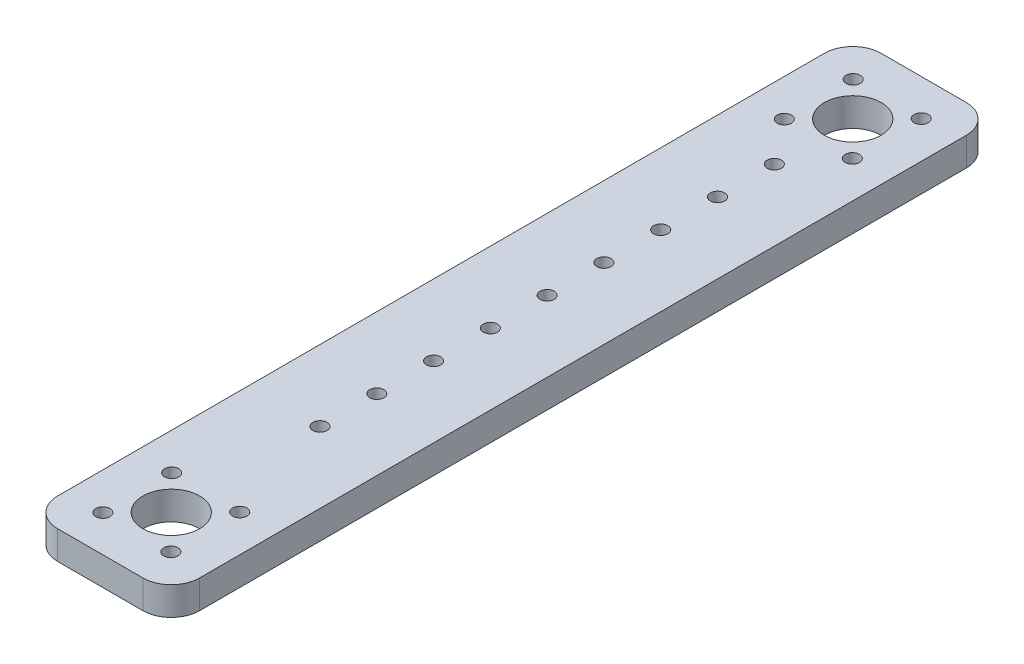
ISO-10303-21;
HEADER;
FILE_DESCRIPTION(('STEP AP214'),'2;1');
FILE_NAME('part.step','',(''),(''),'','','');
FILE_SCHEMA(('AUTOMOTIVE_DESIGN { 1 0 10303 214 1 1 1 1 }'));
ENDSEC;
DATA;
#1=APPLICATION_CONTEXT('core data for automotive mechanical design processes');
#2=APPLICATION_PROTOCOL_DEFINITION('international standard','automotive_design',2000,#1);
#3=PRODUCT_CONTEXT('',#1,'mechanical');
#4=PRODUCT('Part','Part','',(#3));
#5=PRODUCT_RELATED_PRODUCT_CATEGORY('part','',(#4));
#6=PRODUCT_DEFINITION_FORMATION('','',#4);
#7=PRODUCT_DEFINITION_CONTEXT('part definition',#1,'design');
#8=PRODUCT_DEFINITION('design','',#6,#7);
#9=PRODUCT_DEFINITION_SHAPE('','',#8);
#10=(LENGTH_UNIT() NAMED_UNIT(*) SI_UNIT(.MILLI.,.METRE.));
#11=(NAMED_UNIT(*) PLANE_ANGLE_UNIT() SI_UNIT($,.RADIAN.));
#12=(NAMED_UNIT(*) SI_UNIT($,.STERADIAN.) SOLID_ANGLE_UNIT());
#13=UNCERTAINTY_MEASURE_WITH_UNIT(LENGTH_MEASURE(1.E-05),#10,'distance_accuracy_value','');
#14=(GEOMETRIC_REPRESENTATION_CONTEXT(3) GLOBAL_UNCERTAINTY_ASSIGNED_CONTEXT((#13)) GLOBAL_UNIT_ASSIGNED_CONTEXT((#10,
#11,#12)) REPRESENTATION_CONTEXT('',''));
#15=CARTESIAN_POINT('',(0.,0.,0.));
#16=DIRECTION('',(0.,0.,1.));
#17=DIRECTION('',(1.,0.,0.));
#18=AXIS2_PLACEMENT_3D('',#15,#16,#17);
#19=CARTESIAN_POINT('',(0.,25.4,0.));
#20=DIRECTION('',(-1.,0.,0.));
#21=DIRECTION('',(0.,0.,1.));
#22=AXIS2_PLACEMENT_3D('',#19,#20,#21);
#23=PLANE('',#22);
#24=DIRECTION('',(0.,0.,-1.));
#25=VECTOR('',#24,1.);
#26=CARTESIAN_POINT('',(0.,25.4,0.));
#27=LINE('',#26,#25);
#28=CARTESIAN_POINT('',(0.,25.4,-25.4));
#29=VERTEX_POINT('',#28);
#30=CARTESIAN_POINT('',(0.,25.4,-711.2));
#31=VERTEX_POINT('',#30);
#32=EDGE_CURVE('E123',#29,#31,#27,.T.);
#33=ORIENTED_EDGE('',*,*,#32,.F.);
#34=DIRECTION('',(0.,-1.,0.));
#35=VECTOR('',#34,1.);
#36=CARTESIAN_POINT('',(0.,0.,-25.4));
#37=LINE('',#36,#35);
#38=CARTESIAN_POINT('',(0.,0.,-25.4));
#39=VERTEX_POINT('',#38);
#40=EDGE_CURVE('E153',#29,#39,#37,.T.);
#41=ORIENTED_EDGE('',*,*,#40,.T.);
#42=DIRECTION('',(0.,0.,-1.));
#43=VECTOR('',#42,1.);
#44=CARTESIAN_POINT('',(0.,0.,0.));
#45=LINE('',#44,#43);
#46=CARTESIAN_POINT('',(0.,0.,-711.2));
#47=VERTEX_POINT('',#46);
#48=EDGE_CURVE('E107',#39,#47,#45,.T.);
#49=ORIENTED_EDGE('',*,*,#48,.T.);
#50=DIRECTION('',(0.,-1.,0.));
#51=VECTOR('',#50,1.);
#52=CARTESIAN_POINT('',(0.,25.4,-711.2));
#53=LINE('',#52,#51);
#54=EDGE_CURVE('E151',#47,#31,#53,.F.);
#55=ORIENTED_EDGE('',*,*,#54,.T.);
#56=EDGE_LOOP('',(#33,#41,#49,#55));
#57=FACE_BOUND('',#56,.T.);
#58=ADVANCED_FACE('F37',(#57),#23,.F.);
#59=CARTESIAN_POINT('',(0.,25.4,-736.6));
#60=DIRECTION('',(0.,0.,1.));
#61=DIRECTION('',(1.,0.,0.));
#62=AXIS2_PLACEMENT_3D('',#59,#60,#61);
#63=PLANE('',#62);
#64=DIRECTION('',(-1.,0.,0.));
#65=VECTOR('',#64,1.);
#66=CARTESIAN_POINT('',(0.,0.,-736.6));
#67=LINE('',#66,#65);
#68=CARTESIAN_POINT('',(-25.4,0.,-736.6));
#69=VERTEX_POINT('',#68);
#70=CARTESIAN_POINT('',(-101.6,0.,-736.6));
#71=VERTEX_POINT('',#70);
#72=EDGE_CURVE('E158',#69,#71,#67,.T.);
#73=ORIENTED_EDGE('',*,*,#72,.T.);
#74=DIRECTION('',(0.,-1.,0.));
#75=VECTOR('',#74,1.);
#76=CARTESIAN_POINT('',(-101.6,25.4,-736.6));
#77=LINE('',#76,#75);
#78=CARTESIAN_POINT('',(-101.6,25.4,-736.6));
#79=VERTEX_POINT('',#78);
#80=EDGE_CURVE('E11',#71,#79,#77,.F.);
#81=ORIENTED_EDGE('',*,*,#80,.T.);
#82=DIRECTION('',(-1.,0.,0.));
#83=VECTOR('',#82,1.);
#84=CARTESIAN_POINT('',(0.,25.4,-736.6));
#85=LINE('',#84,#83);
#86=CARTESIAN_POINT('',(-25.4,25.4,-736.6));
#87=VERTEX_POINT('',#86);
#88=EDGE_CURVE('E159',#87,#79,#85,.T.);
#89=ORIENTED_EDGE('',*,*,#88,.F.);
#90=DIRECTION('',(0.,-1.,0.));
#91=VECTOR('',#90,1.);
#92=CARTESIAN_POINT('',(-25.4,25.4,-736.6));
#93=LINE('',#92,#91);
#94=EDGE_CURVE('E45',#87,#69,#93,.T.);
#95=ORIENTED_EDGE('',*,*,#94,.T.);
#96=EDGE_LOOP('',(#73,#81,#89,#95));
#97=FACE_BOUND('',#96,.T.);
#98=ADVANCED_FACE('F157',(#97),#63,.F.);
#99=CARTESIAN_POINT('',(-127.,25.4,0.));
#100=DIRECTION('',(-1.,0.,0.));
#101=DIRECTION('',(0.,0.,1.));
#102=AXIS2_PLACEMENT_3D('',#99,#100,#101);
#103=PLANE('',#102);
#104=DIRECTION('',(0.,0.,-1.));
#105=VECTOR('',#104,1.);
#106=CARTESIAN_POINT('',(-127.,0.,0.));
#107=LINE('',#106,#105);
#108=CARTESIAN_POINT('',(-127.,0.,-25.4));
#109=VERTEX_POINT('',#108);
#110=CARTESIAN_POINT('',(-127.,0.,-711.2));
#111=VERTEX_POINT('',#110);
#112=EDGE_CURVE('E124',#109,#111,#107,.T.);
#113=ORIENTED_EDGE('',*,*,#112,.F.);
#114=DIRECTION('',(0.,-1.,0.));
#115=VECTOR('',#114,1.);
#116=CARTESIAN_POINT('',(-127.,25.4,-25.4));
#117=LINE('',#116,#115);
#118=CARTESIAN_POINT('',(-127.,25.4,-25.4));
#119=VERTEX_POINT('',#118);
#120=EDGE_CURVE('E143',#109,#119,#117,.F.);
#121=ORIENTED_EDGE('',*,*,#120,.T.);
#122=DIRECTION('',(0.,0.,-1.));
#123=VECTOR('',#122,1.);
#124=CARTESIAN_POINT('',(-127.,25.4,0.));
#125=LINE('',#124,#123);
#126=CARTESIAN_POINT('',(-127.,25.4,-711.2));
#127=VERTEX_POINT('',#126);
#128=EDGE_CURVE('E133',#119,#127,#125,.T.);
#129=ORIENTED_EDGE('',*,*,#128,.T.);
#130=DIRECTION('',(0.,-1.,0.));
#131=VECTOR('',#130,1.);
#132=CARTESIAN_POINT('',(-127.,0.,-711.2));
#133=LINE('',#132,#131);
#134=EDGE_CURVE('E140',#127,#111,#133,.T.);
#135=ORIENTED_EDGE('',*,*,#134,.T.);
#136=EDGE_LOOP('',(#113,#121,#129,#135));
#137=FACE_BOUND('',#136,.T.);
#138=ADVANCED_FACE('F334',(#137),#103,.T.);
#139=CARTESIAN_POINT('',(0.,25.4,0.));
#140=DIRECTION('',(0.,0.,1.));
#141=DIRECTION('',(1.,0.,0.));
#142=AXIS2_PLACEMENT_3D('',#139,#140,#141);
#143=PLANE('',#142);
#144=DIRECTION('',(-1.,0.,0.));
#145=VECTOR('',#144,1.);
#146=CARTESIAN_POINT('',(0.,25.4,0.));
#147=LINE('',#146,#145);
#148=CARTESIAN_POINT('',(-25.4,25.4,0.));
#149=VERTEX_POINT('',#148);
#150=CARTESIAN_POINT('',(-101.6,25.4,0.));
#151=VERTEX_POINT('',#150);
#152=EDGE_CURVE('E129',#149,#151,#147,.T.);
#153=ORIENTED_EDGE('',*,*,#152,.T.);
#154=DIRECTION('',(0.,-1.,0.));
#155=VECTOR('',#154,1.);
#156=CARTESIAN_POINT('',(-101.6,25.4,0.));
#157=LINE('',#156,#155);
#158=CARTESIAN_POINT('',(-101.6,0.,0.));
#159=VERTEX_POINT('',#158);
#160=EDGE_CURVE('E122',#151,#159,#157,.T.);
#161=ORIENTED_EDGE('',*,*,#160,.T.);
#162=DIRECTION('',(-1.,0.,0.));
#163=VECTOR('',#162,1.);
#164=CARTESIAN_POINT('',(0.,0.,0.));
#165=LINE('',#164,#163);
#166=CARTESIAN_POINT('',(-25.4,0.,0.));
#167=VERTEX_POINT('',#166);
#168=EDGE_CURVE('E105',#167,#159,#165,.T.);
#169=ORIENTED_EDGE('',*,*,#168,.F.);
#170=DIRECTION('',(0.,-1.,0.));
#171=VECTOR('',#170,1.);
#172=CARTESIAN_POINT('',(-25.4,25.4,0.));
#173=LINE('',#172,#171);
#174=EDGE_CURVE('E119',#167,#149,#173,.F.);
#175=ORIENTED_EDGE('',*,*,#174,.T.);
#176=EDGE_LOOP('',(#153,#161,#169,#175));
#177=FACE_BOUND('',#176,.T.);
#178=ADVANCED_FACE('F118',(#177),#143,.T.);
#179=CARTESIAN_POINT('',(0.,25.4,0.));
#180=DIRECTION('',(0.,1.,0.));
#181=DIRECTION('',(0.,0.,1.));
#182=AXIS2_PLACEMENT_3D('',#179,#180,#181);
#183=PLANE('',#182);
#184=CARTESIAN_POINT('',(-93.9235081240994,25.4,-703.91598071188));
#185=DIRECTION('',(0.,1.,0.));
#186=DIRECTION('',(0.,0.,1.));
#187=AXIS2_PLACEMENT_3D('',#184,#185,#186);
#188=CIRCLE('',#187,6.34999999999999);
#189=CARTESIAN_POINT('',(-93.9235081240994,25.4,-697.56598071188));
#190=VERTEX_POINT('',#189);
#191=EDGE_CURVE('E280',#190,#190,#188,.T.);
#192=ORIENTED_EDGE('',*,*,#191,.F.);
#193=EDGE_LOOP('',(#192));
#194=FACE_BOUND('',#193,.T.);
#195=CARTESIAN_POINT('',(-33.0764918759006,25.4,-703.91598071188));
#196=DIRECTION('',(0.,1.,0.));
#197=DIRECTION('',(0.,0.,1.));
#198=AXIS2_PLACEMENT_3D('',#195,#196,#197);
#199=CIRCLE('',#198,6.35);
#200=CARTESIAN_POINT('',(-33.0764918759006,25.4,-697.56598071188));
#201=VERTEX_POINT('',#200);
#202=EDGE_CURVE('E274',#201,#201,#199,.T.);
#203=ORIENTED_EDGE('',*,*,#202,.F.);
#204=EDGE_LOOP('',(#203));
#205=FACE_BOUND('',#204,.T.);
#206=CARTESIAN_POINT('',(-33.0764918759006,25.4,-642.28401928812));
#207=DIRECTION('',(0.,1.,0.));
#208=DIRECTION('',(0.,0.,1.));
#209=AXIS2_PLACEMENT_3D('',#206,#207,#208);
#210=CIRCLE('',#209,6.35);
#211=CARTESIAN_POINT('',(-33.0764918759006,25.4,-635.93401928812));
#212=VERTEX_POINT('',#211);
#213=EDGE_CURVE('E268',#212,#212,#210,.T.);
#214=ORIENTED_EDGE('',*,*,#213,.F.);
#215=EDGE_LOOP('',(#214));
#216=FACE_BOUND('',#215,.T.);
#217=CARTESIAN_POINT('',(-93.9235081240994,25.4,-642.28401928812));
#218=DIRECTION('',(0.,1.,0.));
#219=DIRECTION('',(0.,0.,1.));
#220=AXIS2_PLACEMENT_3D('',#217,#218,#219);
#221=CIRCLE('',#220,6.34999999999999);
#222=CARTESIAN_POINT('',(-93.9235081240994,25.4,-635.93401928812));
#223=VERTEX_POINT('',#222);
#224=EDGE_CURVE('E262',#223,#223,#221,.T.);
#225=ORIENTED_EDGE('',*,*,#224,.F.);
#226=EDGE_LOOP('',(#225));
#227=FACE_BOUND('',#226,.T.);
#228=CARTESIAN_POINT('',(-63.5,25.4,-602.937236363598));
#229=DIRECTION('',(0.,1.,0.));
#230=DIRECTION('',(0.,0.,1.));
#231=AXIS2_PLACEMENT_3D('',#228,#229,#230);
#232=CIRCLE('',#231,6.34999999999999);
#233=CARTESIAN_POINT('',(-63.5,25.4,-596.587236363598));
#234=VERTEX_POINT('',#233);
#235=EDGE_CURVE('E256',#234,#234,#232,.T.);
#236=ORIENTED_EDGE('',*,*,#235,.F.);
#237=EDGE_LOOP('',(#236));
#238=FACE_BOUND('',#237,.T.);
#239=CARTESIAN_POINT('',(-63.4999999999995,25.4,-552.137236363598));
#240=DIRECTION('',(0.,1.,0.));
#241=DIRECTION('',(0.,0.,1.));
#242=AXIS2_PLACEMENT_3D('',#239,#240,#241);
#243=CIRCLE('',#242,6.34999999999999);
#244=CARTESIAN_POINT('',(-63.4999999999995,25.4,-545.787236363598));
#245=VERTEX_POINT('',#244);
#246=EDGE_CURVE('E250',#245,#245,#243,.T.);
#247=ORIENTED_EDGE('',*,*,#246,.F.);
#248=EDGE_LOOP('',(#247));
#249=FACE_BOUND('',#248,.T.);
#250=CARTESIAN_POINT('',(-63.4999999999989,25.4,-501.337236363598));
#251=DIRECTION('',(0.,1.,0.));
#252=DIRECTION('',(0.,0.,1.));
#253=AXIS2_PLACEMENT_3D('',#250,#251,#252);
#254=CIRCLE('',#253,6.34999999999999);
#255=CARTESIAN_POINT('',(-63.4999999999989,25.4,-494.987236363598));
#256=VERTEX_POINT('',#255);
#257=EDGE_CURVE('E244',#256,#256,#254,.T.);
#258=ORIENTED_EDGE('',*,*,#257,.F.);
#259=EDGE_LOOP('',(#258));
#260=FACE_BOUND('',#259,.T.);
#261=CARTESIAN_POINT('',(-63.4999999999984,25.4,-450.537236363598));
#262=DIRECTION('',(0.,1.,0.));
#263=DIRECTION('',(0.,0.,1.));
#264=AXIS2_PLACEMENT_3D('',#261,#262,#263);
#265=CIRCLE('',#264,6.34999999999999);
#266=CARTESIAN_POINT('',(-63.4999999999984,25.4,-444.187236363598));
#267=VERTEX_POINT('',#266);
#268=EDGE_CURVE('E238',#267,#267,#265,.T.);
#269=ORIENTED_EDGE('',*,*,#268,.F.);
#270=EDGE_LOOP('',(#269));
#271=FACE_BOUND('',#270,.T.);
#272=CARTESIAN_POINT('',(-63.4999999999979,25.4,-399.737236363598));
#273=DIRECTION('',(0.,1.,0.));
#274=DIRECTION('',(0.,0.,1.));
#275=AXIS2_PLACEMENT_3D('',#272,#273,#274);
#276=CIRCLE('',#275,6.34999999999999);
#277=CARTESIAN_POINT('',(-63.4999999999979,25.4,-393.387236363598));
#278=VERTEX_POINT('',#277);
#279=EDGE_CURVE('E232',#278,#278,#276,.T.);
#280=ORIENTED_EDGE('',*,*,#279,.F.);
#281=EDGE_LOOP('',(#280));
#282=FACE_BOUND('',#281,.T.);
#283=CARTESIAN_POINT('',(-63.4999999999973,25.4,-348.937236363598));
#284=DIRECTION('',(0.,1.,0.));
#285=DIRECTION('',(0.,0.,1.));
#286=AXIS2_PLACEMENT_3D('',#283,#284,#285);
#287=CIRCLE('',#286,6.34999999999999);
#288=CARTESIAN_POINT('',(-63.4999999999973,25.4,-342.587236363598));
#289=VERTEX_POINT('',#288);
#290=EDGE_CURVE('E226',#289,#289,#287,.T.);
#291=ORIENTED_EDGE('',*,*,#290,.F.);
#292=EDGE_LOOP('',(#291));
#293=FACE_BOUND('',#292,.T.);
#294=CARTESIAN_POINT('',(-63.4999999999968,25.4,-298.137236363598));
#295=DIRECTION('',(0.,1.,0.));
#296=DIRECTION('',(0.,0.,1.));
#297=AXIS2_PLACEMENT_3D('',#294,#295,#296);
#298=CIRCLE('',#297,6.34999999999999);
#299=CARTESIAN_POINT('',(-63.4999999999968,25.4,-291.787236363598));
#300=VERTEX_POINT('',#299);
#301=EDGE_CURVE('E220',#300,#300,#298,.T.);
#302=ORIENTED_EDGE('',*,*,#301,.F.);
#303=EDGE_LOOP('',(#302));
#304=FACE_BOUND('',#303,.T.);
#305=CARTESIAN_POINT('',(-63.4999999999963,25.4,-247.337236363598));
#306=DIRECTION('',(0.,1.,0.));
#307=DIRECTION('',(0.,0.,1.));
#308=AXIS2_PLACEMENT_3D('',#305,#306,#307);
#309=CIRCLE('',#308,6.34999999999999);
#310=CARTESIAN_POINT('',(-63.4999999999963,25.4,-240.987236363598));
#311=VERTEX_POINT('',#310);
#312=EDGE_CURVE('E214',#311,#311,#309,.T.);
#313=ORIENTED_EDGE('',*,*,#312,.F.);
#314=EDGE_LOOP('',(#313));
#315=FACE_BOUND('',#314,.T.);
#316=CARTESIAN_POINT('',(-63.4999999999957,25.4,-196.537236363598));
#317=DIRECTION('',(0.,1.,0.));
#318=DIRECTION('',(0.,0.,1.));
#319=AXIS2_PLACEMENT_3D('',#316,#317,#318);
#320=CIRCLE('',#319,6.34999999999999);
#321=CARTESIAN_POINT('',(-63.4999999999957,25.4,-190.187236363598));
#322=VERTEX_POINT('',#321);
#323=EDGE_CURVE('E208',#322,#322,#320,.T.);
#324=ORIENTED_EDGE('',*,*,#323,.F.);
#325=EDGE_LOOP('',(#324));
#326=FACE_BOUND('',#325,.T.);
#327=CARTESIAN_POINT('',(-93.9235081240994,25.4,-32.68401928812));
#328=DIRECTION('',(0.,1.,0.));
#329=DIRECTION('',(0.,0.,1.));
#330=AXIS2_PLACEMENT_3D('',#327,#328,#329);
#331=CIRCLE('',#330,6.34999999999999);
#332=CARTESIAN_POINT('',(-93.9235081240994,25.4,-26.33401928812));
#333=VERTEX_POINT('',#332);
#334=EDGE_CURVE('E202',#333,#333,#331,.T.);
#335=ORIENTED_EDGE('',*,*,#334,.F.);
#336=EDGE_LOOP('',(#335));
#337=FACE_BOUND('',#336,.T.);
#338=CARTESIAN_POINT('',(-93.9235081240994,25.4,-94.31598071188));
#339=DIRECTION('',(0.,1.,0.));
#340=DIRECTION('',(0.,0.,1.));
#341=AXIS2_PLACEMENT_3D('',#338,#339,#340);
#342=CIRCLE('',#341,6.34999999999999);
#343=CARTESIAN_POINT('',(-93.9235081240994,25.4,-87.96598071188));
#344=VERTEX_POINT('',#343);
#345=EDGE_CURVE('E196',#344,#344,#342,.T.);
#346=ORIENTED_EDGE('',*,*,#345,.F.);
#347=EDGE_LOOP('',(#346));
#348=FACE_BOUND('',#347,.T.);
#349=CARTESIAN_POINT('',(-33.0764918759006,25.4,-94.31598071188));
#350=DIRECTION('',(0.,1.,0.));
#351=DIRECTION('',(0.,0.,1.));
#352=AXIS2_PLACEMENT_3D('',#349,#350,#351);
#353=CIRCLE('',#352,6.35);
#354=CARTESIAN_POINT('',(-33.0764918759006,25.4,-87.96598071188));
#355=VERTEX_POINT('',#354);
#356=EDGE_CURVE('E190',#355,#355,#353,.T.);
#357=ORIENTED_EDGE('',*,*,#356,.F.);
#358=EDGE_LOOP('',(#357));
#359=FACE_BOUND('',#358,.T.);
#360=CARTESIAN_POINT('',(-33.0764918759006,25.4,-32.68401928812));
#361=DIRECTION('',(0.,1.,0.));
#362=DIRECTION('',(0.,0.,1.));
#363=AXIS2_PLACEMENT_3D('',#360,#361,#362);
#364=CIRCLE('',#363,6.35);
#365=CARTESIAN_POINT('',(-33.0764918759006,25.4,-26.33401928812));
#366=VERTEX_POINT('',#365);
#367=EDGE_CURVE('E184',#366,#366,#364,.T.);
#368=ORIENTED_EDGE('',*,*,#367,.F.);
#369=EDGE_LOOP('',(#368));
#370=FACE_BOUND('',#369,.T.);
#371=CARTESIAN_POINT('',(-63.5,25.4,-673.1));
#372=DIRECTION('',(0.,1.,0.));
#373=DIRECTION('',(0.,0.,1.));
#374=AXIS2_PLACEMENT_3D('',#371,#372,#373);
#375=CIRCLE('',#374,25.4);
#376=CARTESIAN_POINT('',(-63.5,25.4,-647.7));
#377=VERTEX_POINT('',#376);
#378=EDGE_CURVE('E178',#377,#377,#375,.T.);
#379=ORIENTED_EDGE('',*,*,#378,.F.);
#380=EDGE_LOOP('',(#379));
#381=FACE_BOUND('',#380,.T.);
#382=CARTESIAN_POINT('',(-63.5,25.4,-63.5));
#383=DIRECTION('',(0.,1.,0.));
#384=DIRECTION('',(0.,0.,1.));
#385=AXIS2_PLACEMENT_3D('',#382,#383,#384);
#386=CIRCLE('',#385,25.4);
#387=CARTESIAN_POINT('',(-63.5,25.4,-38.1));
#388=VERTEX_POINT('',#387);
#389=EDGE_CURVE('E172',#388,#388,#386,.T.);
#390=ORIENTED_EDGE('',*,*,#389,.F.);
#391=EDGE_LOOP('',(#390));
#392=FACE_BOUND('',#391,.T.);
#393=ORIENTED_EDGE('',*,*,#128,.F.);
#394=CARTESIAN_POINT('',(-101.6,25.4,-25.4));
#395=DIRECTION('',(0.,1.,0.));
#396=DIRECTION('',(0.,0.,1.));
#397=AXIS2_PLACEMENT_3D('',#394,#395,#396);
#398=CIRCLE('',#397,25.4);
#399=EDGE_CURVE('E149',#119,#151,#398,.T.);
#400=ORIENTED_EDGE('',*,*,#399,.T.);
#401=ORIENTED_EDGE('',*,*,#152,.F.);
#402=CARTESIAN_POINT('',(-25.4,25.4,-25.4));
#403=DIRECTION('',(0.,1.,0.));
#404=DIRECTION('',(0.,0.,1.));
#405=AXIS2_PLACEMENT_3D('',#402,#403,#404);
#406=CIRCLE('',#405,25.4);
#407=EDGE_CURVE('E128',#149,#29,#406,.T.);
#408=ORIENTED_EDGE('',*,*,#407,.T.);
#409=ORIENTED_EDGE('',*,*,#32,.T.);
#410=CARTESIAN_POINT('',(-25.4,25.4,-711.2));
#411=DIRECTION('',(0.,1.,0.));
#412=DIRECTION('',(0.,0.,1.));
#413=AXIS2_PLACEMENT_3D('',#410,#411,#412);
#414=CIRCLE('',#413,25.4);
#415=EDGE_CURVE('E57',#31,#87,#414,.T.);
#416=ORIENTED_EDGE('',*,*,#415,.T.);
#417=ORIENTED_EDGE('',*,*,#88,.T.);
#418=CARTESIAN_POINT('',(-101.6,25.4,-711.2));
#419=DIRECTION('',(0.,1.,0.));
#420=DIRECTION('',(0.,0.,1.));
#421=AXIS2_PLACEMENT_3D('',#418,#419,#420);
#422=CIRCLE('',#421,25.4);
#423=EDGE_CURVE('E146',#79,#127,#422,.T.);
#424=ORIENTED_EDGE('',*,*,#423,.T.);
#425=EDGE_LOOP('',(#393,#400,#401,#408,#409,#416,#417,#424));
#426=FACE_BOUND('',#425,.T.);
#427=ADVANCED_FACE('F286',(#194,#205,#216,#227,#238,#249,#260,#271,#282,#293,#304,#315,#326,
#337,#348,#359,#370,#381,#392,#426),#183,.T.);
#428=CARTESIAN_POINT('',(0.,0.,0.));
#429=DIRECTION('',(0.,1.,0.));
#430=DIRECTION('',(0.,0.,1.));
#431=AXIS2_PLACEMENT_3D('',#428,#429,#430);
#432=PLANE('',#431);
#433=CARTESIAN_POINT('',(-93.9235081240994,0.,-703.91598071188));
#434=DIRECTION('',(0.,1.,0.));
#435=DIRECTION('',(0.,0.,1.));
#436=AXIS2_PLACEMENT_3D('',#433,#434,#435);
#437=CIRCLE('',#436,6.34999999999999);
#438=CARTESIAN_POINT('',(-93.9235081240994,0.,-697.56598071188));
#439=VERTEX_POINT('',#438);
#440=EDGE_CURVE('E277',#439,#439,#437,.T.);
#441=ORIENTED_EDGE('',*,*,#440,.T.);
#442=EDGE_LOOP('',(#441));
#443=FACE_BOUND('',#442,.T.);
#444=CARTESIAN_POINT('',(-33.0764918759006,0.,-703.91598071188));
#445=DIRECTION('',(0.,1.,0.));
#446=DIRECTION('',(0.,0.,1.));
#447=AXIS2_PLACEMENT_3D('',#444,#445,#446);
#448=CIRCLE('',#447,6.34999999999999);
#449=CARTESIAN_POINT('',(-33.0764918759006,0.,-697.56598071188));
#450=VERTEX_POINT('',#449);
#451=EDGE_CURVE('E271',#450,#450,#448,.T.);
#452=ORIENTED_EDGE('',*,*,#451,.T.);
#453=EDGE_LOOP('',(#452));
#454=FACE_BOUND('',#453,.T.);
#455=CARTESIAN_POINT('',(-33.0764918759006,0.,-642.28401928812));
#456=DIRECTION('',(0.,1.,0.));
#457=DIRECTION('',(0.,0.,1.));
#458=AXIS2_PLACEMENT_3D('',#455,#456,#457);
#459=CIRCLE('',#458,6.34999999999999);
#460=CARTESIAN_POINT('',(-33.0764918759006,0.,-635.93401928812));
#461=VERTEX_POINT('',#460);
#462=EDGE_CURVE('E265',#461,#461,#459,.T.);
#463=ORIENTED_EDGE('',*,*,#462,.T.);
#464=EDGE_LOOP('',(#463));
#465=FACE_BOUND('',#464,.T.);
#466=CARTESIAN_POINT('',(-93.9235081240994,0.,-642.28401928812));
#467=DIRECTION('',(0.,1.,0.));
#468=DIRECTION('',(0.,0.,1.));
#469=AXIS2_PLACEMENT_3D('',#466,#467,#468);
#470=CIRCLE('',#469,6.34999999999999);
#471=CARTESIAN_POINT('',(-93.9235081240994,0.,-635.93401928812));
#472=VERTEX_POINT('',#471);
#473=EDGE_CURVE('E259',#472,#472,#470,.T.);
#474=ORIENTED_EDGE('',*,*,#473,.T.);
#475=EDGE_LOOP('',(#474));
#476=FACE_BOUND('',#475,.T.);
#477=CARTESIAN_POINT('',(-63.5,0.,-602.937236363598));
#478=DIRECTION('',(0.,1.,0.));
#479=DIRECTION('',(0.,0.,1.));
#480=AXIS2_PLACEMENT_3D('',#477,#478,#479);
#481=CIRCLE('',#480,6.34999999999999);
#482=CARTESIAN_POINT('',(-63.5,0.,-596.587236363598));
#483=VERTEX_POINT('',#482);
#484=EDGE_CURVE('E253',#483,#483,#481,.T.);
#485=ORIENTED_EDGE('',*,*,#484,.T.);
#486=EDGE_LOOP('',(#485));
#487=FACE_BOUND('',#486,.T.);
#488=CARTESIAN_POINT('',(-63.4999999999995,0.,-552.137236363598));
#489=DIRECTION('',(0.,1.,0.));
#490=DIRECTION('',(0.,0.,1.));
#491=AXIS2_PLACEMENT_3D('',#488,#489,#490);
#492=CIRCLE('',#491,6.34999999999999);
#493=CARTESIAN_POINT('',(-63.4999999999995,0.,-545.787236363598));
#494=VERTEX_POINT('',#493);
#495=EDGE_CURVE('E247',#494,#494,#492,.T.);
#496=ORIENTED_EDGE('',*,*,#495,.T.);
#497=EDGE_LOOP('',(#496));
#498=FACE_BOUND('',#497,.T.);
#499=CARTESIAN_POINT('',(-63.4999999999989,0.,-501.337236363598));
#500=DIRECTION('',(0.,1.,0.));
#501=DIRECTION('',(0.,0.,1.));
#502=AXIS2_PLACEMENT_3D('',#499,#500,#501);
#503=CIRCLE('',#502,6.34999999999999);
#504=CARTESIAN_POINT('',(-63.4999999999989,0.,-494.987236363598));
#505=VERTEX_POINT('',#504);
#506=EDGE_CURVE('E241',#505,#505,#503,.T.);
#507=ORIENTED_EDGE('',*,*,#506,.T.);
#508=EDGE_LOOP('',(#507));
#509=FACE_BOUND('',#508,.T.);
#510=CARTESIAN_POINT('',(-63.4999999999984,0.,-450.537236363598));
#511=DIRECTION('',(0.,1.,0.));
#512=DIRECTION('',(0.,0.,1.));
#513=AXIS2_PLACEMENT_3D('',#510,#511,#512);
#514=CIRCLE('',#513,6.34999999999999);
#515=CARTESIAN_POINT('',(-63.4999999999984,0.,-444.187236363598));
#516=VERTEX_POINT('',#515);
#517=EDGE_CURVE('E235',#516,#516,#514,.T.);
#518=ORIENTED_EDGE('',*,*,#517,.T.);
#519=EDGE_LOOP('',(#518));
#520=FACE_BOUND('',#519,.T.);
#521=CARTESIAN_POINT('',(-63.4999999999979,0.,-399.737236363598));
#522=DIRECTION('',(0.,1.,0.));
#523=DIRECTION('',(0.,0.,1.));
#524=AXIS2_PLACEMENT_3D('',#521,#522,#523);
#525=CIRCLE('',#524,6.34999999999999);
#526=CARTESIAN_POINT('',(-63.4999999999979,0.,-393.387236363598));
#527=VERTEX_POINT('',#526);
#528=EDGE_CURVE('E229',#527,#527,#525,.T.);
#529=ORIENTED_EDGE('',*,*,#528,.T.);
#530=EDGE_LOOP('',(#529));
#531=FACE_BOUND('',#530,.T.);
#532=CARTESIAN_POINT('',(-63.4999999999973,0.,-348.937236363598));
#533=DIRECTION('',(0.,1.,0.));
#534=DIRECTION('',(0.,0.,1.));
#535=AXIS2_PLACEMENT_3D('',#532,#533,#534);
#536=CIRCLE('',#535,6.34999999999999);
#537=CARTESIAN_POINT('',(-63.4999999999973,0.,-342.587236363598));
#538=VERTEX_POINT('',#537);
#539=EDGE_CURVE('E223',#538,#538,#536,.T.);
#540=ORIENTED_EDGE('',*,*,#539,.T.);
#541=EDGE_LOOP('',(#540));
#542=FACE_BOUND('',#541,.T.);
#543=CARTESIAN_POINT('',(-63.4999999999968,0.,-298.137236363598));
#544=DIRECTION('',(0.,1.,0.));
#545=DIRECTION('',(0.,0.,1.));
#546=AXIS2_PLACEMENT_3D('',#543,#544,#545);
#547=CIRCLE('',#546,6.34999999999999);
#548=CARTESIAN_POINT('',(-63.4999999999968,0.,-291.787236363598));
#549=VERTEX_POINT('',#548);
#550=EDGE_CURVE('E217',#549,#549,#547,.T.);
#551=ORIENTED_EDGE('',*,*,#550,.T.);
#552=EDGE_LOOP('',(#551));
#553=FACE_BOUND('',#552,.T.);
#554=CARTESIAN_POINT('',(-63.4999999999963,0.,-247.337236363598));
#555=DIRECTION('',(0.,1.,0.));
#556=DIRECTION('',(0.,0.,1.));
#557=AXIS2_PLACEMENT_3D('',#554,#555,#556);
#558=CIRCLE('',#557,6.34999999999999);
#559=CARTESIAN_POINT('',(-63.4999999999963,0.,-240.987236363598));
#560=VERTEX_POINT('',#559);
#561=EDGE_CURVE('E211',#560,#560,#558,.T.);
#562=ORIENTED_EDGE('',*,*,#561,.T.);
#563=EDGE_LOOP('',(#562));
#564=FACE_BOUND('',#563,.T.);
#565=CARTESIAN_POINT('',(-63.4999999999957,0.,-196.537236363598));
#566=DIRECTION('',(0.,1.,0.));
#567=DIRECTION('',(0.,0.,1.));
#568=AXIS2_PLACEMENT_3D('',#565,#566,#567);
#569=CIRCLE('',#568,6.34999999999999);
#570=CARTESIAN_POINT('',(-63.4999999999957,0.,-190.187236363598));
#571=VERTEX_POINT('',#570);
#572=EDGE_CURVE('E205',#571,#571,#569,.T.);
#573=ORIENTED_EDGE('',*,*,#572,.T.);
#574=EDGE_LOOP('',(#573));
#575=FACE_BOUND('',#574,.T.);
#576=CARTESIAN_POINT('',(-93.9235081240994,0.,-32.68401928812));
#577=DIRECTION('',(0.,1.,0.));
#578=DIRECTION('',(0.,0.,1.));
#579=AXIS2_PLACEMENT_3D('',#576,#577,#578);
#580=CIRCLE('',#579,6.34999999999999);
#581=CARTESIAN_POINT('',(-93.9235081240994,0.,-26.33401928812));
#582=VERTEX_POINT('',#581);
#583=EDGE_CURVE('E199',#582,#582,#580,.T.);
#584=ORIENTED_EDGE('',*,*,#583,.T.);
#585=EDGE_LOOP('',(#584));
#586=FACE_BOUND('',#585,.T.);
#587=CARTESIAN_POINT('',(-93.9235081240994,0.,-94.31598071188));
#588=DIRECTION('',(0.,1.,0.));
#589=DIRECTION('',(0.,0.,1.));
#590=AXIS2_PLACEMENT_3D('',#587,#588,#589);
#591=CIRCLE('',#590,6.34999999999999);
#592=CARTESIAN_POINT('',(-93.9235081240994,0.,-87.96598071188));
#593=VERTEX_POINT('',#592);
#594=EDGE_CURVE('E193',#593,#593,#591,.T.);
#595=ORIENTED_EDGE('',*,*,#594,.T.);
#596=EDGE_LOOP('',(#595));
#597=FACE_BOUND('',#596,.T.);
#598=CARTESIAN_POINT('',(-33.0764918759006,0.,-94.31598071188));
#599=DIRECTION('',(0.,1.,0.));
#600=DIRECTION('',(0.,0.,1.));
#601=AXIS2_PLACEMENT_3D('',#598,#599,#600);
#602=CIRCLE('',#601,6.34999999999999);
#603=CARTESIAN_POINT('',(-33.0764918759006,0.,-87.96598071188));
#604=VERTEX_POINT('',#603);
#605=EDGE_CURVE('E187',#604,#604,#602,.T.);
#606=ORIENTED_EDGE('',*,*,#605,.T.);
#607=EDGE_LOOP('',(#606));
#608=FACE_BOUND('',#607,.T.);
#609=CARTESIAN_POINT('',(-33.0764918759006,0.,-32.68401928812));
#610=DIRECTION('',(0.,1.,0.));
#611=DIRECTION('',(0.,0.,1.));
#612=AXIS2_PLACEMENT_3D('',#609,#610,#611);
#613=CIRCLE('',#612,6.34999999999999);
#614=CARTESIAN_POINT('',(-33.0764918759006,0.,-26.33401928812));
#615=VERTEX_POINT('',#614);
#616=EDGE_CURVE('E181',#615,#615,#613,.T.);
#617=ORIENTED_EDGE('',*,*,#616,.T.);
#618=EDGE_LOOP('',(#617));
#619=FACE_BOUND('',#618,.T.);
#620=CARTESIAN_POINT('',(-63.5,0.,-673.1));
#621=DIRECTION('',(0.,1.,0.));
#622=DIRECTION('',(0.,0.,1.));
#623=AXIS2_PLACEMENT_3D('',#620,#621,#622);
#624=CIRCLE('',#623,25.4);
#625=CARTESIAN_POINT('',(-63.5,0.,-647.7));
#626=VERTEX_POINT('',#625);
#627=EDGE_CURVE('E175',#626,#626,#624,.T.);
#628=ORIENTED_EDGE('',*,*,#627,.T.);
#629=EDGE_LOOP('',(#628));
#630=FACE_BOUND('',#629,.T.);
#631=CARTESIAN_POINT('',(-63.5,0.,-63.5));
#632=DIRECTION('',(0.,1.,0.));
#633=DIRECTION('',(0.,0.,1.));
#634=AXIS2_PLACEMENT_3D('',#631,#632,#633);
#635=CIRCLE('',#634,25.4);
#636=CARTESIAN_POINT('',(-63.5,0.,-38.1));
#637=VERTEX_POINT('',#636);
#638=EDGE_CURVE('E163',#637,#637,#635,.T.);
#639=ORIENTED_EDGE('',*,*,#638,.T.);
#640=EDGE_LOOP('',(#639));
#641=FACE_BOUND('',#640,.T.);
#642=ORIENTED_EDGE('',*,*,#168,.T.);
#643=CARTESIAN_POINT('',(-101.6,0.,-25.4));
#644=DIRECTION('',(0.,1.,0.));
#645=DIRECTION('',(0.,0.,1.));
#646=AXIS2_PLACEMENT_3D('',#643,#644,#645);
#647=CIRCLE('',#646,25.4);
#648=EDGE_CURVE('E112',#159,#109,#647,.F.);
#649=ORIENTED_EDGE('',*,*,#648,.T.);
#650=ORIENTED_EDGE('',*,*,#112,.T.);
#651=CARTESIAN_POINT('',(-101.6,0.,-711.2));
#652=DIRECTION('',(0.,1.,0.));
#653=DIRECTION('',(0.,0.,1.));
#654=AXIS2_PLACEMENT_3D('',#651,#652,#653);
#655=CIRCLE('',#654,25.4);
#656=EDGE_CURVE('E113',#111,#71,#655,.F.);
#657=ORIENTED_EDGE('',*,*,#656,.T.);
#658=ORIENTED_EDGE('',*,*,#72,.F.);
#659=CARTESIAN_POINT('',(-25.4,0.,-711.2));
#660=DIRECTION('',(0.,1.,0.));
#661=DIRECTION('',(0.,0.,1.));
#662=AXIS2_PLACEMENT_3D('',#659,#660,#661);
#663=CIRCLE('',#662,25.4);
#664=EDGE_CURVE('E131',#69,#47,#663,.F.);
#665=ORIENTED_EDGE('',*,*,#664,.T.);
#666=ORIENTED_EDGE('',*,*,#48,.F.);
#667=CARTESIAN_POINT('',(-25.4,0.,-25.4));
#668=DIRECTION('',(0.,1.,0.));
#669=DIRECTION('',(0.,0.,1.));
#670=AXIS2_PLACEMENT_3D('',#667,#668,#669);
#671=CIRCLE('',#670,25.4);
#672=EDGE_CURVE('E102',#39,#167,#671,.F.);
#673=ORIENTED_EDGE('',*,*,#672,.T.);
#674=EDGE_LOOP('',(#642,#649,#650,#657,#658,#665,#666,#673));
#675=FACE_BOUND('',#674,.T.);
#676=ADVANCED_FACE('F104',(#443,#454,#465,#476,#487,#498,#509,#520,#531,#542,#553,#564,#575,
#586,#597,#608,#619,#630,#641,#675),#432,.F.);
#677=CARTESIAN_POINT('',(-63.5,25.4,-63.5));
#678=DIRECTION('',(0.,1.,0.));
#679=DIRECTION('',(0.,0.,1.));
#680=AXIS2_PLACEMENT_3D('',#677,#678,#679);
#681=CYLINDRICAL_SURFACE('',#680,25.4);
#682=ORIENTED_EDGE('',*,*,#638,.F.);
#683=EDGE_LOOP('',(#682));
#684=FACE_BOUND('',#683,.T.);
#685=ORIENTED_EDGE('',*,*,#389,.T.);
#686=EDGE_LOOP('',(#685));
#687=FACE_BOUND('',#686,.T.);
#688=ADVANCED_FACE('F430',(#684,#687),#681,.F.);
#689=CARTESIAN_POINT('',(-63.5,25.4,-673.1));
#690=DIRECTION('',(0.,1.,0.));
#691=DIRECTION('',(0.,0.,1.));
#692=AXIS2_PLACEMENT_3D('',#689,#690,#691);
#693=CYLINDRICAL_SURFACE('',#692,25.4);
#694=ORIENTED_EDGE('',*,*,#627,.F.);
#695=EDGE_LOOP('',(#694));
#696=FACE_BOUND('',#695,.T.);
#697=ORIENTED_EDGE('',*,*,#378,.T.);
#698=EDGE_LOOP('',(#697));
#699=FACE_BOUND('',#698,.T.);
#700=ADVANCED_FACE('F426',(#696,#699),#693,.F.);
#701=CARTESIAN_POINT('',(-33.0764918759006,25.4,-32.68401928812));
#702=DIRECTION('',(0.,1.,0.));
#703=DIRECTION('',(0.,0.,1.));
#704=AXIS2_PLACEMENT_3D('',#701,#702,#703);
#705=CYLINDRICAL_SURFACE('',#704,6.35);
#706=ORIENTED_EDGE('',*,*,#616,.F.);
#707=EDGE_LOOP('',(#706));
#708=FACE_BOUND('',#707,.T.);
#709=ORIENTED_EDGE('',*,*,#367,.T.);
#710=EDGE_LOOP('',(#709));
#711=FACE_BOUND('',#710,.T.);
#712=ADVANCED_FACE('F422',(#708,#711),#705,.F.);
#713=CARTESIAN_POINT('',(-33.0764918759006,25.4,-94.31598071188));
#714=DIRECTION('',(0.,1.,0.));
#715=DIRECTION('',(0.,0.,1.));
#716=AXIS2_PLACEMENT_3D('',#713,#714,#715);
#717=CYLINDRICAL_SURFACE('',#716,6.35);
#718=ORIENTED_EDGE('',*,*,#605,.F.);
#719=EDGE_LOOP('',(#718));
#720=FACE_BOUND('',#719,.T.);
#721=ORIENTED_EDGE('',*,*,#356,.T.);
#722=EDGE_LOOP('',(#721));
#723=FACE_BOUND('',#722,.T.);
#724=ADVANCED_FACE('F418',(#720,#723),#717,.F.);
#725=CARTESIAN_POINT('',(-93.9235081240994,25.4,-94.31598071188));
#726=DIRECTION('',(0.,1.,0.));
#727=DIRECTION('',(0.,0.,1.));
#728=AXIS2_PLACEMENT_3D('',#725,#726,#727);
#729=CYLINDRICAL_SURFACE('',#728,6.34999999999999);
#730=ORIENTED_EDGE('',*,*,#594,.F.);
#731=EDGE_LOOP('',(#730));
#732=FACE_BOUND('',#731,.T.);
#733=ORIENTED_EDGE('',*,*,#345,.T.);
#734=EDGE_LOOP('',(#733));
#735=FACE_BOUND('',#734,.T.);
#736=ADVANCED_FACE('F414',(#732,#735),#729,.F.);
#737=CARTESIAN_POINT('',(-93.9235081240994,25.4,-32.68401928812));
#738=DIRECTION('',(0.,1.,0.));
#739=DIRECTION('',(0.,0.,1.));
#740=AXIS2_PLACEMENT_3D('',#737,#738,#739);
#741=CYLINDRICAL_SURFACE('',#740,6.34999999999999);
#742=ORIENTED_EDGE('',*,*,#583,.F.);
#743=EDGE_LOOP('',(#742));
#744=FACE_BOUND('',#743,.T.);
#745=ORIENTED_EDGE('',*,*,#334,.T.);
#746=EDGE_LOOP('',(#745));
#747=FACE_BOUND('',#746,.T.);
#748=ADVANCED_FACE('F410',(#744,#747),#741,.F.);
#749=CARTESIAN_POINT('',(-63.4999999999957,25.4,-196.537236363598));
#750=DIRECTION('',(0.,1.,0.));
#751=DIRECTION('',(0.,0.,1.));
#752=AXIS2_PLACEMENT_3D('',#749,#750,#751);
#753=CYLINDRICAL_SURFACE('',#752,6.34999999999999);
#754=ORIENTED_EDGE('',*,*,#572,.F.);
#755=EDGE_LOOP('',(#754));
#756=FACE_BOUND('',#755,.T.);
#757=ORIENTED_EDGE('',*,*,#323,.T.);
#758=EDGE_LOOP('',(#757));
#759=FACE_BOUND('',#758,.T.);
#760=ADVANCED_FACE('F406',(#756,#759),#753,.F.);
#761=CARTESIAN_POINT('',(-63.4999999999963,25.4,-247.337236363598));
#762=DIRECTION('',(0.,1.,0.));
#763=DIRECTION('',(0.,0.,1.));
#764=AXIS2_PLACEMENT_3D('',#761,#762,#763);
#765=CYLINDRICAL_SURFACE('',#764,6.34999999999999);
#766=ORIENTED_EDGE('',*,*,#561,.F.);
#767=EDGE_LOOP('',(#766));
#768=FACE_BOUND('',#767,.T.);
#769=ORIENTED_EDGE('',*,*,#312,.T.);
#770=EDGE_LOOP('',(#769));
#771=FACE_BOUND('',#770,.T.);
#772=ADVANCED_FACE('F402',(#768,#771),#765,.F.);
#773=CARTESIAN_POINT('',(-63.4999999999968,25.4,-298.137236363598));
#774=DIRECTION('',(0.,1.,0.));
#775=DIRECTION('',(0.,0.,1.));
#776=AXIS2_PLACEMENT_3D('',#773,#774,#775);
#777=CYLINDRICAL_SURFACE('',#776,6.34999999999999);
#778=ORIENTED_EDGE('',*,*,#550,.F.);
#779=EDGE_LOOP('',(#778));
#780=FACE_BOUND('',#779,.T.);
#781=ORIENTED_EDGE('',*,*,#301,.T.);
#782=EDGE_LOOP('',(#781));
#783=FACE_BOUND('',#782,.T.);
#784=ADVANCED_FACE('F398',(#780,#783),#777,.F.);
#785=CARTESIAN_POINT('',(-63.4999999999973,25.4,-348.937236363598));
#786=DIRECTION('',(0.,1.,0.));
#787=DIRECTION('',(0.,0.,1.));
#788=AXIS2_PLACEMENT_3D('',#785,#786,#787);
#789=CYLINDRICAL_SURFACE('',#788,6.34999999999999);
#790=ORIENTED_EDGE('',*,*,#539,.F.);
#791=EDGE_LOOP('',(#790));
#792=FACE_BOUND('',#791,.T.);
#793=ORIENTED_EDGE('',*,*,#290,.T.);
#794=EDGE_LOOP('',(#793));
#795=FACE_BOUND('',#794,.T.);
#796=ADVANCED_FACE('F394',(#792,#795),#789,.F.);
#797=CARTESIAN_POINT('',(-63.4999999999979,25.4,-399.737236363598));
#798=DIRECTION('',(0.,1.,0.));
#799=DIRECTION('',(0.,0.,1.));
#800=AXIS2_PLACEMENT_3D('',#797,#798,#799);
#801=CYLINDRICAL_SURFACE('',#800,6.34999999999999);
#802=ORIENTED_EDGE('',*,*,#528,.F.);
#803=EDGE_LOOP('',(#802));
#804=FACE_BOUND('',#803,.T.);
#805=ORIENTED_EDGE('',*,*,#279,.T.);
#806=EDGE_LOOP('',(#805));
#807=FACE_BOUND('',#806,.T.);
#808=ADVANCED_FACE('F390',(#804,#807),#801,.F.);
#809=CARTESIAN_POINT('',(-63.4999999999984,25.4,-450.537236363598));
#810=DIRECTION('',(0.,1.,0.));
#811=DIRECTION('',(0.,0.,1.));
#812=AXIS2_PLACEMENT_3D('',#809,#810,#811);
#813=CYLINDRICAL_SURFACE('',#812,6.34999999999999);
#814=ORIENTED_EDGE('',*,*,#517,.F.);
#815=EDGE_LOOP('',(#814));
#816=FACE_BOUND('',#815,.T.);
#817=ORIENTED_EDGE('',*,*,#268,.T.);
#818=EDGE_LOOP('',(#817));
#819=FACE_BOUND('',#818,.T.);
#820=ADVANCED_FACE('F386',(#816,#819),#813,.F.);
#821=CARTESIAN_POINT('',(-63.4999999999989,25.4,-501.337236363598));
#822=DIRECTION('',(0.,1.,0.));
#823=DIRECTION('',(0.,0.,1.));
#824=AXIS2_PLACEMENT_3D('',#821,#822,#823);
#825=CYLINDRICAL_SURFACE('',#824,6.34999999999999);
#826=ORIENTED_EDGE('',*,*,#506,.F.);
#827=EDGE_LOOP('',(#826));
#828=FACE_BOUND('',#827,.T.);
#829=ORIENTED_EDGE('',*,*,#257,.T.);
#830=EDGE_LOOP('',(#829));
#831=FACE_BOUND('',#830,.T.);
#832=ADVANCED_FACE('F382',(#828,#831),#825,.F.);
#833=CARTESIAN_POINT('',(-63.4999999999995,25.4,-552.137236363598));
#834=DIRECTION('',(0.,1.,0.));
#835=DIRECTION('',(0.,0.,1.));
#836=AXIS2_PLACEMENT_3D('',#833,#834,#835);
#837=CYLINDRICAL_SURFACE('',#836,6.34999999999999);
#838=ORIENTED_EDGE('',*,*,#495,.F.);
#839=EDGE_LOOP('',(#838));
#840=FACE_BOUND('',#839,.T.);
#841=ORIENTED_EDGE('',*,*,#246,.T.);
#842=EDGE_LOOP('',(#841));
#843=FACE_BOUND('',#842,.T.);
#844=ADVANCED_FACE('F378',(#840,#843),#837,.F.);
#845=CARTESIAN_POINT('',(-63.5,25.4,-602.937236363598));
#846=DIRECTION('',(0.,1.,0.));
#847=DIRECTION('',(0.,0.,1.));
#848=AXIS2_PLACEMENT_3D('',#845,#846,#847);
#849=CYLINDRICAL_SURFACE('',#848,6.34999999999999);
#850=ORIENTED_EDGE('',*,*,#484,.F.);
#851=EDGE_LOOP('',(#850));
#852=FACE_BOUND('',#851,.T.);
#853=ORIENTED_EDGE('',*,*,#235,.T.);
#854=EDGE_LOOP('',(#853));
#855=FACE_BOUND('',#854,.T.);
#856=ADVANCED_FACE('F374',(#852,#855),#849,.F.);
#857=CARTESIAN_POINT('',(-93.9235081240994,25.4,-642.28401928812));
#858=DIRECTION('',(0.,1.,0.));
#859=DIRECTION('',(0.,0.,1.));
#860=AXIS2_PLACEMENT_3D('',#857,#858,#859);
#861=CYLINDRICAL_SURFACE('',#860,6.34999999999999);
#862=ORIENTED_EDGE('',*,*,#473,.F.);
#863=EDGE_LOOP('',(#862));
#864=FACE_BOUND('',#863,.T.);
#865=ORIENTED_EDGE('',*,*,#224,.T.);
#866=EDGE_LOOP('',(#865));
#867=FACE_BOUND('',#866,.T.);
#868=ADVANCED_FACE('F370',(#864,#867),#861,.F.);
#869=CARTESIAN_POINT('',(-33.0764918759006,25.4,-642.28401928812));
#870=DIRECTION('',(0.,1.,0.));
#871=DIRECTION('',(0.,0.,1.));
#872=AXIS2_PLACEMENT_3D('',#869,#870,#871);
#873=CYLINDRICAL_SURFACE('',#872,6.35);
#874=ORIENTED_EDGE('',*,*,#462,.F.);
#875=EDGE_LOOP('',(#874));
#876=FACE_BOUND('',#875,.T.);
#877=ORIENTED_EDGE('',*,*,#213,.T.);
#878=EDGE_LOOP('',(#877));
#879=FACE_BOUND('',#878,.T.);
#880=ADVANCED_FACE('F363',(#876,#879),#873,.F.);
#881=CARTESIAN_POINT('',(-33.0764918759006,25.4,-703.91598071188));
#882=DIRECTION('',(0.,1.,0.));
#883=DIRECTION('',(0.,0.,1.));
#884=AXIS2_PLACEMENT_3D('',#881,#882,#883);
#885=CYLINDRICAL_SURFACE('',#884,6.35);
#886=ORIENTED_EDGE('',*,*,#451,.F.);
#887=EDGE_LOOP('',(#886));
#888=FACE_BOUND('',#887,.T.);
#889=ORIENTED_EDGE('',*,*,#202,.T.);
#890=EDGE_LOOP('',(#889));
#891=FACE_BOUND('',#890,.T.);
#892=ADVANCED_FACE('F357',(#888,#891),#885,.F.);
#893=CARTESIAN_POINT('',(-93.9235081240994,25.4,-703.91598071188));
#894=DIRECTION('',(0.,1.,0.));
#895=DIRECTION('',(0.,0.,1.));
#896=AXIS2_PLACEMENT_3D('',#893,#894,#895);
#897=CYLINDRICAL_SURFACE('',#896,6.34999999999999);
#898=ORIENTED_EDGE('',*,*,#440,.F.);
#899=EDGE_LOOP('',(#898));
#900=FACE_BOUND('',#899,.T.);
#901=ORIENTED_EDGE('',*,*,#191,.T.);
#902=EDGE_LOOP('',(#901));
#903=FACE_BOUND('',#902,.T.);
#904=ADVANCED_FACE('F284',(#900,#903),#897,.F.);
#905=CARTESIAN_POINT('',(-101.6,25.4,-25.4));
#906=DIRECTION('',(0.,-1.,0.));
#907=DIRECTION('',(0.,0.,-1.));
#908=AXIS2_PLACEMENT_3D('',#905,#906,#907);
#909=CYLINDRICAL_SURFACE('',#908,25.4);
#910=ORIENTED_EDGE('',*,*,#399,.F.);
#911=ORIENTED_EDGE('',*,*,#120,.F.);
#912=ORIENTED_EDGE('',*,*,#648,.F.);
#913=ORIENTED_EDGE('',*,*,#160,.F.);
#914=EDGE_LOOP('',(#910,#911,#912,#913));
#915=FACE_BOUND('',#914,.T.);
#916=ADVANCED_FACE('F332',(#915),#909,.T.);
#917=CARTESIAN_POINT('',(-25.4,25.4,-25.4));
#918=DIRECTION('',(0.,1.,0.));
#919=DIRECTION('',(0.,0.,1.));
#920=AXIS2_PLACEMENT_3D('',#917,#918,#919);
#921=CYLINDRICAL_SURFACE('',#920,25.4);
#922=ORIENTED_EDGE('',*,*,#407,.F.);
#923=ORIENTED_EDGE('',*,*,#174,.F.);
#924=ORIENTED_EDGE('',*,*,#672,.F.);
#925=ORIENTED_EDGE('',*,*,#40,.F.);
#926=EDGE_LOOP('',(#922,#923,#924,#925));
#927=FACE_BOUND('',#926,.T.);
#928=ADVANCED_FACE('F127',(#927),#921,.T.);
#929=CARTESIAN_POINT('',(-101.6,25.4,-711.2));
#930=DIRECTION('',(0.,1.,0.));
#931=DIRECTION('',(0.,0.,1.));
#932=AXIS2_PLACEMENT_3D('',#929,#930,#931);
#933=CYLINDRICAL_SURFACE('',#932,25.4);
#934=ORIENTED_EDGE('',*,*,#423,.F.);
#935=ORIENTED_EDGE('',*,*,#80,.F.);
#936=ORIENTED_EDGE('',*,*,#656,.F.);
#937=ORIENTED_EDGE('',*,*,#134,.F.);
#938=EDGE_LOOP('',(#934,#935,#936,#937));
#939=FACE_BOUND('',#938,.T.);
#940=ADVANCED_FACE('F336',(#939),#933,.T.);
#941=CARTESIAN_POINT('',(-25.4,25.4,-711.2));
#942=DIRECTION('',(0.,-1.,0.));
#943=DIRECTION('',(0.,0.,-1.));
#944=AXIS2_PLACEMENT_3D('',#941,#942,#943);
#945=CYLINDRICAL_SURFACE('',#944,25.4);
#946=ORIENTED_EDGE('',*,*,#415,.F.);
#947=ORIENTED_EDGE('',*,*,#54,.F.);
#948=ORIENTED_EDGE('',*,*,#664,.F.);
#949=ORIENTED_EDGE('',*,*,#94,.F.);
#950=EDGE_LOOP('',(#946,#947,#948,#949));
#951=FACE_BOUND('',#950,.T.);
#952=ADVANCED_FACE('F39',(#951),#945,.T.);
#953=CLOSED_SHELL('',(#58,#98,#138,#178,#427,#676,#688,#700,#712,#724,#736,#748,#760,#772,#784,
#796,#808,#820,#832,#844,#856,#868,#880,#892,#904,#916,#928,#940,#952));
#954=MANIFOLD_SOLID_BREP('B2',#953);
#955=ADVANCED_BREP_SHAPE_REPRESENTATION('',(#18,#954),#14);
#956=SHAPE_DEFINITION_REPRESENTATION(#9,#955);
ENDSEC;
END-ISO-10303-21;
